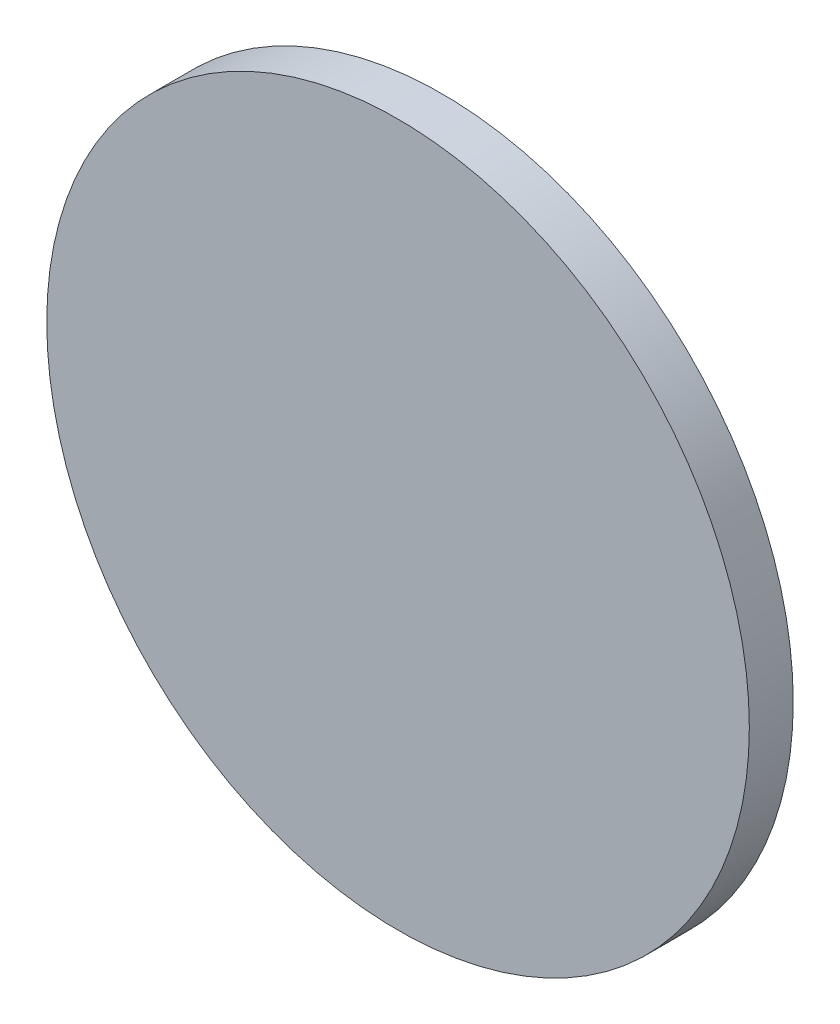
ISO-10303-21;
HEADER;
FILE_DESCRIPTION(('STEP AP214'),'2;1');
FILE_NAME('part.step','',(''),(''),'','','');
FILE_SCHEMA(('AUTOMOTIVE_DESIGN { 1 0 10303 214 1 1 1 1 }'));
ENDSEC;
DATA;
#1=APPLICATION_CONTEXT('core data for automotive mechanical design processes');
#2=APPLICATION_PROTOCOL_DEFINITION('international standard','automotive_design',2000,#1);
#3=PRODUCT_CONTEXT('',#1,'mechanical');
#4=PRODUCT('Part','Part','',(#3));
#5=PRODUCT_RELATED_PRODUCT_CATEGORY('part','',(#4));
#6=PRODUCT_DEFINITION_FORMATION('','',#4);
#7=PRODUCT_DEFINITION_CONTEXT('part definition',#1,'design');
#8=PRODUCT_DEFINITION('design','',#6,#7);
#9=PRODUCT_DEFINITION_SHAPE('','',#8);
#10=(LENGTH_UNIT() NAMED_UNIT(*) SI_UNIT(.MILLI.,.METRE.));
#11=(NAMED_UNIT(*) PLANE_ANGLE_UNIT() SI_UNIT($,.RADIAN.));
#12=(NAMED_UNIT(*) SI_UNIT($,.STERADIAN.) SOLID_ANGLE_UNIT());
#13=UNCERTAINTY_MEASURE_WITH_UNIT(LENGTH_MEASURE(1.E-05),#10,'distance_accuracy_value','');
#14=(GEOMETRIC_REPRESENTATION_CONTEXT(3) GLOBAL_UNCERTAINTY_ASSIGNED_CONTEXT((#13)) GLOBAL_UNIT_ASSIGNED_CONTEXT((#10,
#11,#12)) REPRESENTATION_CONTEXT('',''));
#15=CARTESIAN_POINT('',(0.,0.,0.));
#16=DIRECTION('',(0.,0.,1.));
#17=DIRECTION('',(1.,0.,0.));
#18=AXIS2_PLACEMENT_3D('',#15,#16,#17);
#19=CARTESIAN_POINT('',(0.,0.,15.));
#20=DIRECTION('',(0.,0.,-1.));
#21=DIRECTION('',(-1.,0.,0.));
#22=AXIS2_PLACEMENT_3D('',#19,#20,#21);
#23=CYLINDRICAL_SURFACE('',#22,120.);
#24=CARTESIAN_POINT('',(0.,0.,15.));
#25=DIRECTION('',(0.,0.,1.));
#26=DIRECTION('',(1.,0.,0.));
#27=AXIS2_PLACEMENT_3D('',#24,#25,#26);
#28=CIRCLE('',#27,120.);
#29=CARTESIAN_POINT('',(120.,0.,15.));
#30=VERTEX_POINT('',#29);
#31=EDGE_CURVE('E10',#30,#30,#28,.T.);
#32=ORIENTED_EDGE('',*,*,#31,.F.);
#33=EDGE_LOOP('',(#32));
#34=FACE_BOUND('',#33,.T.);
#35=CARTESIAN_POINT('',(0.,0.,0.));
#36=DIRECTION('',(0.,0.,1.));
#37=DIRECTION('',(1.,0.,0.));
#38=AXIS2_PLACEMENT_3D('',#35,#36,#37);
#39=CIRCLE('',#38,120.);
#40=CARTESIAN_POINT('',(120.,0.,0.));
#41=VERTEX_POINT('',#40);
#42=EDGE_CURVE('E35',#41,#41,#39,.T.);
#43=ORIENTED_EDGE('',*,*,#42,.T.);
#44=EDGE_LOOP('',(#43));
#45=FACE_BOUND('',#44,.T.);
#46=ADVANCED_FACE('F32',(#34,#45),#23,.T.);
#47=CARTESIAN_POINT('',(0.,0.,15.));
#48=DIRECTION('',(0.,0.,1.));
#49=DIRECTION('',(1.,0.,0.));
#50=AXIS2_PLACEMENT_3D('',#47,#48,#49);
#51=PLANE('',#50);
#52=ORIENTED_EDGE('',*,*,#31,.T.);
#53=EDGE_LOOP('',(#52));
#54=FACE_BOUND('',#53,.T.);
#55=ADVANCED_FACE('F47',(#54),#51,.T.);
#56=CARTESIAN_POINT('',(0.,0.,0.));
#57=DIRECTION('',(0.,0.,1.));
#58=DIRECTION('',(1.,0.,0.));
#59=AXIS2_PLACEMENT_3D('',#56,#57,#58);
#60=PLANE('',#59);
#61=ORIENTED_EDGE('',*,*,#42,.F.);
#62=EDGE_LOOP('',(#61));
#63=FACE_BOUND('',#62,.T.);
#64=ADVANCED_FACE('F45',(#63),#60,.F.);
#65=CLOSED_SHELL('',(#46,#55,#64));
#66=MANIFOLD_SOLID_BREP('B2',#65);
#67=ADVANCED_BREP_SHAPE_REPRESENTATION('',(#18,#66),#14);
#68=SHAPE_DEFINITION_REPRESENTATION(#9,#67);
ENDSEC;
END-ISO-10303-21;
